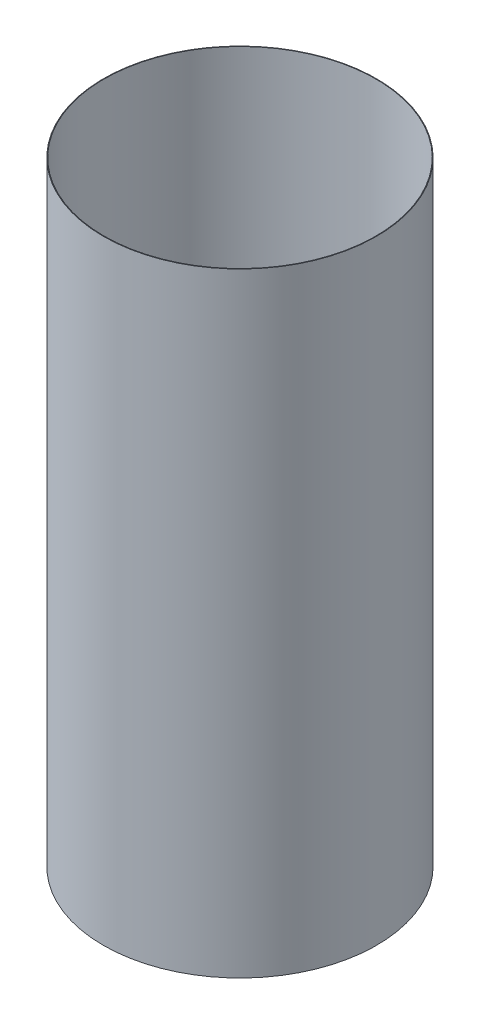
ISO-10303-21;
HEADER;
FILE_DESCRIPTION(('STEP AP214'),'2;1');
FILE_NAME('part.step','',(''),(''),'','','');
FILE_SCHEMA(('AUTOMOTIVE_DESIGN { 1 0 10303 214 1 1 1 1 }'));
ENDSEC;
DATA;
#1=APPLICATION_CONTEXT('core data for automotive mechanical design processes');
#2=APPLICATION_PROTOCOL_DEFINITION('international standard','automotive_design',2000,#1);
#3=PRODUCT_CONTEXT('',#1,'mechanical');
#4=PRODUCT('Part','Part','',(#3));
#5=PRODUCT_RELATED_PRODUCT_CATEGORY('part','',(#4));
#6=PRODUCT_DEFINITION_FORMATION('','',#4);
#7=PRODUCT_DEFINITION_CONTEXT('part definition',#1,'design');
#8=PRODUCT_DEFINITION('design','',#6,#7);
#9=PRODUCT_DEFINITION_SHAPE('','',#8);
#10=(LENGTH_UNIT() NAMED_UNIT(*) SI_UNIT(.MILLI.,.METRE.));
#11=(NAMED_UNIT(*) PLANE_ANGLE_UNIT() SI_UNIT($,.RADIAN.));
#12=(NAMED_UNIT(*) SI_UNIT($,.STERADIAN.) SOLID_ANGLE_UNIT());
#13=UNCERTAINTY_MEASURE_WITH_UNIT(LENGTH_MEASURE(1.E-05),#10,'distance_accuracy_value','');
#14=(GEOMETRIC_REPRESENTATION_CONTEXT(3) GLOBAL_UNCERTAINTY_ASSIGNED_CONTEXT((#13)) GLOBAL_UNIT_ASSIGNED_CONTEXT((#10,
#11,#12)) REPRESENTATION_CONTEXT('',''));
#15=CARTESIAN_POINT('',(0.,0.,0.));
#16=DIRECTION('',(0.,0.,1.));
#17=DIRECTION('',(1.,0.,0.));
#18=AXIS2_PLACEMENT_3D('',#15,#16,#17);
#19=CARTESIAN_POINT('',(0.,130.175,0.));
#20=DIRECTION('',(0.,1.,0.));
#21=DIRECTION('',(0.,0.,1.));
#22=AXIS2_PLACEMENT_3D('',#19,#20,#21);
#23=PLANE('',#22);
#24=CARTESIAN_POINT('',(0.,130.175,0.));
#25=DIRECTION('',(0.,1.,0.));
#26=DIRECTION('',(0.,0.,1.));
#27=AXIS2_PLACEMENT_3D('',#24,#25,#26);
#28=CIRCLE('',#27,28.956);
#29=CARTESIAN_POINT('',(0.,130.175,28.956));
#30=VERTEX_POINT('',#29);
#31=EDGE_CURVE('E10',#30,#30,#28,.T.);
#32=ORIENTED_EDGE('',*,*,#31,.T.);
#33=EDGE_LOOP('',(#32));
#34=FACE_BOUND('',#33,.T.);
#35=CARTESIAN_POINT('',(0.,130.175,0.));
#36=DIRECTION('',(0.,1.,0.));
#37=DIRECTION('',(0.,0.,1.));
#38=AXIS2_PLACEMENT_3D('',#35,#36,#37);
#39=CIRCLE('',#38,28.829);
#40=CARTESIAN_POINT('',(0.,130.175,28.829));
#41=VERTEX_POINT('',#40);
#42=EDGE_CURVE('E42',#41,#41,#39,.T.);
#43=ORIENTED_EDGE('',*,*,#42,.F.);
#44=EDGE_LOOP('',(#43));
#45=FACE_BOUND('',#44,.T.);
#46=ADVANCED_FACE('F31',(#34,#45),#23,.T.);
#47=CARTESIAN_POINT('',(0.,0.,0.));
#48=DIRECTION('',(0.,1.,0.));
#49=DIRECTION('',(0.,0.,1.));
#50=AXIS2_PLACEMENT_3D('',#47,#48,#49);
#51=PLANE('',#50);
#52=CARTESIAN_POINT('',(0.,0.,0.));
#53=DIRECTION('',(0.,1.,0.));
#54=DIRECTION('',(0.,0.,1.));
#55=AXIS2_PLACEMENT_3D('',#52,#53,#54);
#56=CIRCLE('',#55,28.956);
#57=CARTESIAN_POINT('',(0.,0.,28.956));
#58=VERTEX_POINT('',#57);
#59=EDGE_CURVE('E35',#58,#58,#56,.T.);
#60=ORIENTED_EDGE('',*,*,#59,.F.);
#61=EDGE_LOOP('',(#60));
#62=FACE_BOUND('',#61,.T.);
#63=CARTESIAN_POINT('',(0.,0.,0.));
#64=DIRECTION('',(0.,1.,0.));
#65=DIRECTION('',(0.,0.,1.));
#66=AXIS2_PLACEMENT_3D('',#63,#64,#65);
#67=CIRCLE('',#66,28.829);
#68=CARTESIAN_POINT('',(0.,0.,28.829));
#69=VERTEX_POINT('',#68);
#70=EDGE_CURVE('E44',#69,#69,#67,.T.);
#71=ORIENTED_EDGE('',*,*,#70,.T.);
#72=EDGE_LOOP('',(#71));
#73=FACE_BOUND('',#72,.T.);
#74=ADVANCED_FACE('F54',(#62,#73),#51,.F.);
#75=CARTESIAN_POINT('',(0.,130.175,0.));
#76=DIRECTION('',(0.,-1.,0.));
#77=DIRECTION('',(0.,0.,-1.));
#78=AXIS2_PLACEMENT_3D('',#75,#76,#77);
#79=CYLINDRICAL_SURFACE('',#78,28.956);
#80=ORIENTED_EDGE('',*,*,#31,.F.);
#81=EDGE_LOOP('',(#80));
#82=FACE_BOUND('',#81,.T.);
#83=ORIENTED_EDGE('',*,*,#59,.T.);
#84=EDGE_LOOP('',(#83));
#85=FACE_BOUND('',#84,.T.);
#86=ADVANCED_FACE('F33',(#82,#85),#79,.T.);
#87=CARTESIAN_POINT('',(0.,130.175,0.));
#88=DIRECTION('',(0.,-1.,0.));
#89=DIRECTION('',(0.,0.,-1.));
#90=AXIS2_PLACEMENT_3D('',#87,#88,#89);
#91=CYLINDRICAL_SURFACE('',#90,28.829);
#92=ORIENTED_EDGE('',*,*,#42,.T.);
#93=EDGE_LOOP('',(#92));
#94=FACE_BOUND('',#93,.T.);
#95=ORIENTED_EDGE('',*,*,#70,.F.);
#96=EDGE_LOOP('',(#95));
#97=FACE_BOUND('',#96,.T.);
#98=ADVANCED_FACE('F50',(#94,#97),#91,.F.);
#99=CLOSED_SHELL('',(#46,#74,#86,#98));
#100=MANIFOLD_SOLID_BREP('B2',#99);
#101=ADVANCED_BREP_SHAPE_REPRESENTATION('',(#18,#100),#14);
#102=SHAPE_DEFINITION_REPRESENTATION(#9,#101);
ENDSEC;
END-ISO-10303-21;
